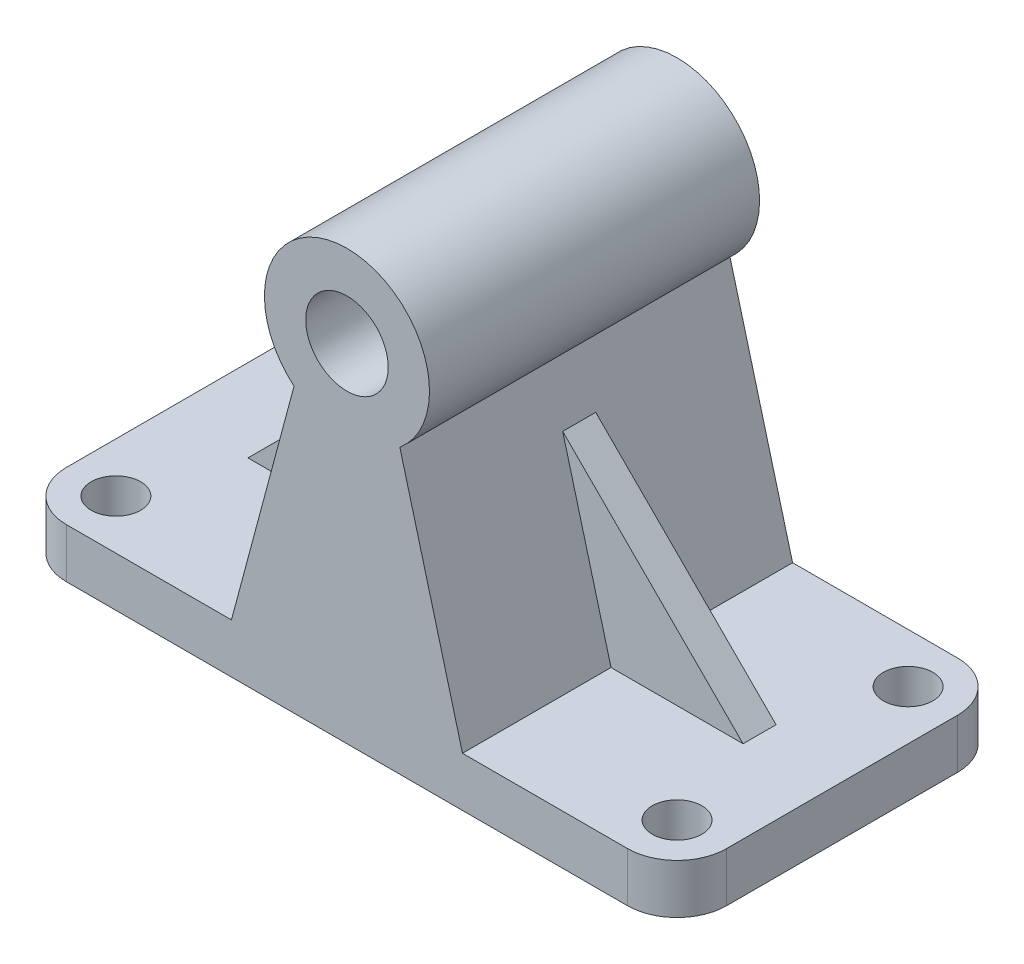
ISO-10303-21;
HEADER;
FILE_DESCRIPTION(('STEP AP214'),'2;1');
FILE_NAME('part.step','',(''),(''),'','','');
FILE_SCHEMA(('AUTOMOTIVE_DESIGN { 1 0 10303 214 1 1 1 1 }'));
ENDSEC;
DATA;
#1=APPLICATION_CONTEXT('core data for automotive mechanical design processes');
#2=APPLICATION_PROTOCOL_DEFINITION('international standard','automotive_design',2000,#1);
#3=PRODUCT_CONTEXT('',#1,'mechanical');
#4=PRODUCT('Part','Part','',(#3));
#5=PRODUCT_RELATED_PRODUCT_CATEGORY('part','',(#4));
#6=PRODUCT_DEFINITION_FORMATION('','',#4);
#7=PRODUCT_DEFINITION_CONTEXT('part definition',#1,'design');
#8=PRODUCT_DEFINITION('design','',#6,#7);
#9=PRODUCT_DEFINITION_SHAPE('','',#8);
#10=(LENGTH_UNIT() NAMED_UNIT(*) SI_UNIT(.MILLI.,.METRE.));
#11=(NAMED_UNIT(*) PLANE_ANGLE_UNIT() SI_UNIT($,.RADIAN.));
#12=(NAMED_UNIT(*) SI_UNIT($,.STERADIAN.) SOLID_ANGLE_UNIT());
#13=UNCERTAINTY_MEASURE_WITH_UNIT(LENGTH_MEASURE(1.E-05),#10,'distance_accuracy_value','');
#14=(GEOMETRIC_REPRESENTATION_CONTEXT(3) GLOBAL_UNCERTAINTY_ASSIGNED_CONTEXT((#13)) GLOBAL_UNIT_ASSIGNED_CONTEXT((#10,
#11,#12)) REPRESENTATION_CONTEXT('',''));
#15=CARTESIAN_POINT('',(0.,0.,0.));
#16=DIRECTION('',(0.,0.,1.));
#17=DIRECTION('',(1.,0.,0.));
#18=AXIS2_PLACEMENT_3D('',#15,#16,#17);
#19=CARTESIAN_POINT('',(0.,105.,50.));
#20=DIRECTION('',(0.,0.,1.));
#21=DIRECTION('',(1.,0.,0.));
#22=AXIS2_PLACEMENT_3D('',#19,#20,#21);
#23=PLANE('',#22);
#24=DIRECTION('',(-1.,0.,0.));
#25=VECTOR('',#24,1.);
#26=CARTESIAN_POINT('',(-100.,15.,50.));
#27=LINE('',#26,#25);
#28=CARTESIAN_POINT('',(-35.,15.,50.));
#29=VERTEX_POINT('',#28);
#30=CARTESIAN_POINT('',(-85.,15.,50.));
#31=VERTEX_POINT('',#30);
#32=EDGE_CURVE('E284',#29,#31,#27,.T.);
#33=ORIENTED_EDGE('',*,*,#32,.T.);
#34=DIRECTION('',(0.,-1.,0.));
#35=VECTOR('',#34,1.);
#36=CARTESIAN_POINT('',(-85.,0.,50.));
#37=LINE('',#36,#35);
#38=CARTESIAN_POINT('',(-85.,0.,50.));
#39=VERTEX_POINT('',#38);
#40=EDGE_CURVE('E341',#31,#39,#37,.T.);
#41=ORIENTED_EDGE('',*,*,#40,.T.);
#42=DIRECTION('',(1.,0.,0.));
#43=VECTOR('',#42,1.);
#44=CARTESIAN_POINT('',(-100.,0.,50.));
#45=LINE('',#44,#43);
#46=CARTESIAN_POINT('',(85.,0.,50.));
#47=VERTEX_POINT('',#46);
#48=EDGE_CURVE('E267',#39,#47,#45,.T.);
#49=ORIENTED_EDGE('',*,*,#48,.T.);
#50=DIRECTION('',(0.,1.,0.));
#51=VECTOR('',#50,1.);
#52=CARTESIAN_POINT('',(85.,15.,50.));
#53=LINE('',#52,#51);
#54=CARTESIAN_POINT('',(85.,15.,50.));
#55=VERTEX_POINT('',#54);
#56=EDGE_CURVE('E337',#47,#55,#53,.T.);
#57=ORIENTED_EDGE('',*,*,#56,.T.);
#58=DIRECTION('',(-1.,0.,0.));
#59=VECTOR('',#58,1.);
#60=CARTESIAN_POINT('',(35.,15.,50.));
#61=LINE('',#60,#59);
#62=CARTESIAN_POINT('',(35.,15.,50.));
#63=VERTEX_POINT('',#62);
#64=EDGE_CURVE('E271',#55,#63,#61,.T.);
#65=ORIENTED_EDGE('',*,*,#64,.T.);
#66=DIRECTION('',(-0.258819045102518,0.965925826289069,0.));
#67=VECTOR('',#66,1.);
#68=CARTESIAN_POINT('',(16.025916537381,85.8122435095476,50.));
#69=LINE('',#68,#67);
#70=CARTESIAN_POINT('',(16.025916537381,85.8122435095476,50.));
#71=VERTEX_POINT('',#70);
#72=EDGE_CURVE('E275',#63,#71,#69,.T.);
#73=ORIENTED_EDGE('',*,*,#72,.T.);
#74=CARTESIAN_POINT('',(0.,105.,50.));
#75=DIRECTION('',(0.,0.,1.));
#76=DIRECTION('',(1.,0.,0.));
#77=AXIS2_PLACEMENT_3D('',#74,#75,#76);
#78=CIRCLE('',#77,25.);
#79=CARTESIAN_POINT('',(-16.025916537381,85.8122435095476,50.));
#80=VERTEX_POINT('',#79);
#81=EDGE_CURVE('E278',#71,#80,#78,.T.);
#82=ORIENTED_EDGE('',*,*,#81,.T.);
#83=DIRECTION('',(-0.258819045102518,-0.965925826289069,0.));
#84=VECTOR('',#83,1.);
#85=CARTESIAN_POINT('',(-35.,15.,50.));
#86=LINE('',#85,#84);
#87=EDGE_CURVE('E281',#80,#29,#86,.T.);
#88=ORIENTED_EDGE('',*,*,#87,.T.);
#89=EDGE_LOOP('',(#33,#41,#49,#57,#65,#73,#82,#88));
#90=FACE_BOUND('',#89,.T.);
#91=CARTESIAN_POINT('',(0.,105.,50.));
#92=DIRECTION('',(0.,0.,1.));
#93=DIRECTION('',(1.,0.,0.));
#94=AXIS2_PLACEMENT_3D('',#91,#92,#93);
#95=CIRCLE('',#94,12.5);
#96=CARTESIAN_POINT('',(12.5,105.,50.));
#97=VERTEX_POINT('',#96);
#98=EDGE_CURVE('E259',#97,#97,#95,.T.);
#99=ORIENTED_EDGE('',*,*,#98,.F.);
#100=EDGE_LOOP('',(#99));
#101=FACE_BOUND('',#100,.T.);
#102=ADVANCED_FACE('F39',(#90,#101),#23,.T.);
#103=CARTESIAN_POINT('',(0.,105.,-50.));
#104=DIRECTION('',(0.,0.,1.));
#105=DIRECTION('',(1.,0.,0.));
#106=AXIS2_PLACEMENT_3D('',#103,#104,#105);
#107=PLANE('',#106);
#108=DIRECTION('',(1.,0.,0.));
#109=VECTOR('',#108,1.);
#110=CARTESIAN_POINT('',(-100.,0.,-50.));
#111=LINE('',#110,#109);
#112=CARTESIAN_POINT('',(-85.,0.,-50.));
#113=VERTEX_POINT('',#112);
#114=CARTESIAN_POINT('',(85.,0.,-50.));
#115=VERTEX_POINT('',#114);
#116=EDGE_CURVE('E263',#113,#115,#111,.T.);
#117=ORIENTED_EDGE('',*,*,#116,.F.);
#118=DIRECTION('',(0.,-1.,0.));
#119=VECTOR('',#118,1.);
#120=CARTESIAN_POINT('',(-85.,105.,-50.));
#121=LINE('',#120,#119);
#122=CARTESIAN_POINT('',(-85.,15.,-50.));
#123=VERTEX_POINT('',#122);
#124=EDGE_CURVE('E375',#113,#123,#121,.F.);
#125=ORIENTED_EDGE('',*,*,#124,.T.);
#126=DIRECTION('',(-1.,0.,0.));
#127=VECTOR('',#126,1.);
#128=CARTESIAN_POINT('',(-100.,15.,-50.));
#129=LINE('',#128,#127);
#130=CARTESIAN_POINT('',(-35.,15.,-50.));
#131=VERTEX_POINT('',#130);
#132=EDGE_CURVE('E272',#131,#123,#129,.T.);
#133=ORIENTED_EDGE('',*,*,#132,.F.);
#134=DIRECTION('',(-0.258819045102518,-0.965925826289069,0.));
#135=VECTOR('',#134,1.);
#136=CARTESIAN_POINT('',(-35.,15.,-50.));
#137=LINE('',#136,#135);
#138=CARTESIAN_POINT('',(-16.025916537381,85.8122435095476,-50.));
#139=VERTEX_POINT('',#138);
#140=EDGE_CURVE('E304',#139,#131,#137,.T.);
#141=ORIENTED_EDGE('',*,*,#140,.F.);
#142=CARTESIAN_POINT('',(0.,105.,-50.));
#143=DIRECTION('',(0.,0.,1.));
#144=DIRECTION('',(1.,0.,0.));
#145=AXIS2_PLACEMENT_3D('',#142,#143,#144);
#146=CIRCLE('',#145,25.);
#147=CARTESIAN_POINT('',(16.025916537381,85.8122435095476,-50.));
#148=VERTEX_POINT('',#147);
#149=EDGE_CURVE('E300',#148,#139,#146,.T.);
#150=ORIENTED_EDGE('',*,*,#149,.F.);
#151=DIRECTION('',(-0.258819045102518,0.965925826289069,0.));
#152=VECTOR('',#151,1.);
#153=CARTESIAN_POINT('',(16.025916537381,85.8122435095476,-50.));
#154=LINE('',#153,#152);
#155=CARTESIAN_POINT('',(35.,15.,-50.));
#156=VERTEX_POINT('',#155);
#157=EDGE_CURVE('E296',#156,#148,#154,.T.);
#158=ORIENTED_EDGE('',*,*,#157,.F.);
#159=DIRECTION('',(-1.,0.,0.));
#160=VECTOR('',#159,1.);
#161=CARTESIAN_POINT('',(35.,15.,-50.));
#162=LINE('',#161,#160);
#163=CARTESIAN_POINT('',(85.,15.,-50.));
#164=VERTEX_POINT('',#163);
#165=EDGE_CURVE('E292',#164,#156,#162,.T.);
#166=ORIENTED_EDGE('',*,*,#165,.F.);
#167=DIRECTION('',(0.,1.,0.));
#168=VECTOR('',#167,1.);
#169=CARTESIAN_POINT('',(85.,105.,-50.));
#170=LINE('',#169,#168);
#171=EDGE_CURVE('E372',#164,#115,#170,.F.);
#172=ORIENTED_EDGE('',*,*,#171,.T.);
#173=EDGE_LOOP('',(#117,#125,#133,#141,#150,#158,#166,#172));
#174=FACE_BOUND('',#173,.T.);
#175=CARTESIAN_POINT('',(0.,105.,-50.));
#176=DIRECTION('',(0.,0.,1.));
#177=DIRECTION('',(1.,0.,0.));
#178=AXIS2_PLACEMENT_3D('',#175,#176,#177);
#179=CIRCLE('',#178,12.5);
#180=CARTESIAN_POINT('',(12.5,105.,-50.));
#181=VERTEX_POINT('',#180);
#182=EDGE_CURVE('E255',#181,#181,#179,.T.);
#183=ORIENTED_EDGE('',*,*,#182,.T.);
#184=EDGE_LOOP('',(#183));
#185=FACE_BOUND('',#184,.T.);
#186=ADVANCED_FACE('F425',(#174,#185),#107,.F.);
#187=CARTESIAN_POINT('',(-100.,0.,50.));
#188=DIRECTION('',(1.,0.,0.));
#189=DIRECTION('',(0.,0.,-1.));
#190=AXIS2_PLACEMENT_3D('',#187,#188,#189);
#191=PLANE('',#190);
#192=DIRECTION('',(0.,0.,-1.));
#193=VECTOR('',#192,1.);
#194=CARTESIAN_POINT('',(-100.,15.,50.));
#195=LINE('',#194,#193);
#196=CARTESIAN_POINT('',(-100.,15.,35.));
#197=VERTEX_POINT('',#196);
#198=CARTESIAN_POINT('',(-100.,15.,-35.));
#199=VERTEX_POINT('',#198);
#200=EDGE_CURVE('E288',#197,#199,#195,.T.);
#201=ORIENTED_EDGE('',*,*,#200,.T.);
#202=DIRECTION('',(0.,-1.,0.));
#203=VECTOR('',#202,1.);
#204=CARTESIAN_POINT('',(-100.,0.,-35.));
#205=LINE('',#204,#203);
#206=CARTESIAN_POINT('',(-100.,0.,-35.));
#207=VERTEX_POINT('',#206);
#208=EDGE_CURVE('E358',#199,#207,#205,.T.);
#209=ORIENTED_EDGE('',*,*,#208,.T.);
#210=DIRECTION('',(0.,0.,-1.));
#211=VECTOR('',#210,1.);
#212=CARTESIAN_POINT('',(-100.,0.,50.));
#213=LINE('',#212,#211);
#214=CARTESIAN_POINT('',(-100.,0.,35.));
#215=VERTEX_POINT('',#214);
#216=EDGE_CURVE('E334',#215,#207,#213,.T.);
#217=ORIENTED_EDGE('',*,*,#216,.F.);
#218=DIRECTION('',(0.,-1.,0.));
#219=VECTOR('',#218,1.);
#220=CARTESIAN_POINT('',(-100.,15.,35.));
#221=LINE('',#220,#219);
#222=EDGE_CURVE('E362',#215,#197,#221,.F.);
#223=ORIENTED_EDGE('',*,*,#222,.T.);
#224=EDGE_LOOP('',(#201,#209,#217,#223));
#225=FACE_BOUND('',#224,.T.);
#226=ADVANCED_FACE('F415',(#225),#191,.F.);
#227=CARTESIAN_POINT('',(-100.,0.,50.));
#228=DIRECTION('',(0.,1.,0.));
#229=DIRECTION('',(0.,0.,1.));
#230=AXIS2_PLACEMENT_3D('',#227,#228,#229);
#231=PLANE('',#230);
#232=CARTESIAN_POINT('',(85.,0.,-35.));
#233=DIRECTION('',(0.,1.,0.));
#234=DIRECTION('',(0.,0.,1.));
#235=AXIS2_PLACEMENT_3D('',#232,#233,#234);
#236=CIRCLE('',#235,15.);
#237=CARTESIAN_POINT('',(100.,0.,-35.));
#238=VERTEX_POINT('',#237);
#239=EDGE_CURVE('E348',#115,#238,#236,.F.);
#240=ORIENTED_EDGE('',*,*,#239,.T.);
#241=DIRECTION('',(0.,0.,-1.));
#242=VECTOR('',#241,1.);
#243=CARTESIAN_POINT('',(100.,0.,50.));
#244=LINE('',#243,#242);
#245=CARTESIAN_POINT('',(100.,0.,35.));
#246=VERTEX_POINT('',#245);
#247=EDGE_CURVE('E331',#246,#238,#244,.T.);
#248=ORIENTED_EDGE('',*,*,#247,.F.);
#249=CARTESIAN_POINT('',(85.,0.,35.));
#250=DIRECTION('',(0.,1.,0.));
#251=DIRECTION('',(0.,0.,1.));
#252=AXIS2_PLACEMENT_3D('',#249,#250,#251);
#253=CIRCLE('',#252,15.);
#254=EDGE_CURVE('E345',#246,#47,#253,.F.);
#255=ORIENTED_EDGE('',*,*,#254,.T.);
#256=ORIENTED_EDGE('',*,*,#48,.F.);
#257=CARTESIAN_POINT('',(-85.,0.,35.));
#258=DIRECTION('',(0.,1.,0.));
#259=DIRECTION('',(0.,0.,1.));
#260=AXIS2_PLACEMENT_3D('',#257,#258,#259);
#261=CIRCLE('',#260,15.);
#262=EDGE_CURVE('E355',#39,#215,#261,.F.);
#263=ORIENTED_EDGE('',*,*,#262,.T.);
#264=ORIENTED_EDGE('',*,*,#216,.T.);
#265=CARTESIAN_POINT('',(-85.,0.,-35.));
#266=DIRECTION('',(0.,1.,0.));
#267=DIRECTION('',(0.,0.,1.));
#268=AXIS2_PLACEMENT_3D('',#265,#266,#267);
#269=CIRCLE('',#268,15.);
#270=EDGE_CURVE('E352',#207,#113,#269,.F.);
#271=ORIENTED_EDGE('',*,*,#270,.T.);
#272=ORIENTED_EDGE('',*,*,#116,.T.);
#273=EDGE_LOOP('',(#240,#248,#255,#256,#263,#264,#271,#272));
#274=FACE_BOUND('',#273,.T.);
#275=CARTESIAN_POINT('',(-85.,0.,35.));
#276=DIRECTION('',(0.,1.,0.));
#277=DIRECTION('',(-1.,0.,0.));
#278=AXIS2_PLACEMENT_3D('',#275,#276,#277);
#279=CIRCLE('',#278,7.50000000000001);
#280=CARTESIAN_POINT('',(-92.5,0.,35.));
#281=VERTEX_POINT('',#280);
#282=EDGE_CURVE('E235',#281,#281,#279,.T.);
#283=ORIENTED_EDGE('',*,*,#282,.T.);
#284=EDGE_LOOP('',(#283));
#285=FACE_BOUND('',#284,.T.);
#286=CARTESIAN_POINT('',(85.,0.,-35.));
#287=DIRECTION('',(0.,1.,0.));
#288=DIRECTION('',(-1.,0.,0.));
#289=AXIS2_PLACEMENT_3D('',#286,#287,#288);
#290=CIRCLE('',#289,7.50000000000001);
#291=CARTESIAN_POINT('',(77.5,0.,-35.));
#292=VERTEX_POINT('',#291);
#293=EDGE_CURVE('E244',#292,#292,#290,.T.);
#294=ORIENTED_EDGE('',*,*,#293,.T.);
#295=EDGE_LOOP('',(#294));
#296=FACE_BOUND('',#295,.T.);
#297=CARTESIAN_POINT('',(85.,0.,35.));
#298=DIRECTION('',(0.,1.,0.));
#299=DIRECTION('',(-1.,0.,0.));
#300=AXIS2_PLACEMENT_3D('',#297,#298,#299);
#301=CIRCLE('',#300,7.50000000000001);
#302=CARTESIAN_POINT('',(77.5,0.,35.));
#303=VERTEX_POINT('',#302);
#304=EDGE_CURVE('E227',#303,#303,#301,.T.);
#305=ORIENTED_EDGE('',*,*,#304,.T.);
#306=EDGE_LOOP('',(#305));
#307=FACE_BOUND('',#306,.T.);
#308=CARTESIAN_POINT('',(-85.,0.,-35.));
#309=DIRECTION('',(0.,1.,0.));
#310=DIRECTION('',(-1.,0.,0.));
#311=AXIS2_PLACEMENT_3D('',#308,#309,#310);
#312=CIRCLE('',#311,7.50000000000001);
#313=CARTESIAN_POINT('',(-92.5,0.,-35.));
#314=VERTEX_POINT('',#313);
#315=EDGE_CURVE('E251',#314,#314,#312,.T.);
#316=ORIENTED_EDGE('',*,*,#315,.T.);
#317=EDGE_LOOP('',(#316));
#318=FACE_BOUND('',#317,.T.);
#319=ADVANCED_FACE('F402',(#274,#285,#296,#307,#318),#231,.F.);
#320=CARTESIAN_POINT('',(100.,0.,50.));
#321=DIRECTION('',(-1.,0.,0.));
#322=DIRECTION('',(0.,0.,1.));
#323=AXIS2_PLACEMENT_3D('',#320,#321,#322);
#324=PLANE('',#323);
#325=ORIENTED_EDGE('',*,*,#247,.T.);
#326=DIRECTION('',(0.,1.,0.));
#327=VECTOR('',#326,1.);
#328=CARTESIAN_POINT('',(100.,0.,-35.));
#329=LINE('',#328,#327);
#330=CARTESIAN_POINT('',(100.,15.,-35.));
#331=VERTEX_POINT('',#330);
#332=EDGE_CURVE('E381',#238,#331,#329,.T.);
#333=ORIENTED_EDGE('',*,*,#332,.T.);
#334=DIRECTION('',(0.,0.,-1.));
#335=VECTOR('',#334,1.);
#336=CARTESIAN_POINT('',(100.,15.,50.));
#337=LINE('',#336,#335);
#338=CARTESIAN_POINT('',(100.,15.,35.));
#339=VERTEX_POINT('',#338);
#340=EDGE_CURVE('E328',#339,#331,#337,.T.);
#341=ORIENTED_EDGE('',*,*,#340,.F.);
#342=DIRECTION('',(0.,1.,0.));
#343=VECTOR('',#342,1.);
#344=CARTESIAN_POINT('',(100.,0.,35.));
#345=LINE('',#344,#343);
#346=EDGE_CURVE('E378',#339,#246,#345,.F.);
#347=ORIENTED_EDGE('',*,*,#346,.T.);
#348=EDGE_LOOP('',(#325,#333,#341,#347));
#349=FACE_BOUND('',#348,.T.);
#350=ADVANCED_FACE('F396',(#349),#324,.F.);
#351=CARTESIAN_POINT('',(35.,15.,50.));
#352=DIRECTION('',(0.,-1.,0.));
#353=DIRECTION('',(1.,0.,0.));
#354=AXIS2_PLACEMENT_3D('',#351,#352,#353);
#355=PLANE('',#354);
#356=CARTESIAN_POINT('',(85.,15.,35.));
#357=DIRECTION('',(0.,1.,0.));
#358=DIRECTION('',(-1.,0.,0.));
#359=AXIS2_PLACEMENT_3D('',#356,#357,#358);
#360=CIRCLE('',#359,7.50000000000001);
#361=CARTESIAN_POINT('',(77.5,15.,35.));
#362=VERTEX_POINT('',#361);
#363=EDGE_CURVE('E226',#362,#362,#360,.T.);
#364=ORIENTED_EDGE('',*,*,#363,.F.);
#365=EDGE_LOOP('',(#364));
#366=FACE_BOUND('',#365,.T.);
#367=ORIENTED_EDGE('',*,*,#340,.T.);
#368=CARTESIAN_POINT('',(85.,15.,-35.));
#369=DIRECTION('',(0.,-1.,0.));
#370=DIRECTION('',(1.,0.,0.));
#371=AXIS2_PLACEMENT_3D('',#368,#369,#370);
#372=CIRCLE('',#371,15.);
#373=EDGE_CURVE('E11',#331,#164,#372,.F.);
#374=ORIENTED_EDGE('',*,*,#373,.T.);
#375=ORIENTED_EDGE('',*,*,#165,.T.);
#376=DIRECTION('',(0.,0.,-1.));
#377=VECTOR('',#376,1.);
#378=CARTESIAN_POINT('',(35.,15.,50.));
#379=LINE('',#378,#377);
#380=CARTESIAN_POINT('',(35.,15.,-5.));
#381=VERTEX_POINT('',#380);
#382=EDGE_CURVE('E323',#381,#156,#379,.T.);
#383=ORIENTED_EDGE('',*,*,#382,.F.);
#384=DIRECTION('',(-1.,0.,0.));
#385=VECTOR('',#384,1.);
#386=CARTESIAN_POINT('',(35.,15.,-5.));
#387=LINE('',#386,#385);
#388=CARTESIAN_POINT('',(75.,15.,-5.));
#389=VERTEX_POINT('',#388);
#390=EDGE_CURVE('E210',#389,#381,#387,.T.);
#391=ORIENTED_EDGE('',*,*,#390,.F.);
#392=DIRECTION('',(0.,0.,1.));
#393=VECTOR('',#392,1.);
#394=CARTESIAN_POINT('',(75.,15.,50.));
#395=LINE('',#394,#393);
#396=CARTESIAN_POINT('',(75.,15.,5.));
#397=VERTEX_POINT('',#396);
#398=EDGE_CURVE('E223',#389,#397,#395,.T.);
#399=ORIENTED_EDGE('',*,*,#398,.T.);
#400=DIRECTION('',(-1.,0.,0.));
#401=VECTOR('',#400,1.);
#402=CARTESIAN_POINT('',(35.,15.,5.));
#403=LINE('',#402,#401);
#404=CARTESIAN_POINT('',(35.,15.,5.));
#405=VERTEX_POINT('',#404);
#406=EDGE_CURVE('E217',#397,#405,#403,.T.);
#407=ORIENTED_EDGE('',*,*,#406,.T.);
#408=EDGE_CURVE('E324',#63,#405,#379,.T.);
#409=ORIENTED_EDGE('',*,*,#408,.F.);
#410=ORIENTED_EDGE('',*,*,#64,.F.);
#411=CARTESIAN_POINT('',(85.,15.,35.));
#412=DIRECTION('',(0.,-1.,0.));
#413=DIRECTION('',(1.,0.,0.));
#414=AXIS2_PLACEMENT_3D('',#411,#412,#413);
#415=CIRCLE('',#414,15.);
#416=EDGE_CURVE('E48',#55,#339,#415,.F.);
#417=ORIENTED_EDGE('',*,*,#416,.T.);
#418=EDGE_LOOP('',(#367,#374,#375,#383,#391,#399,#407,#409,#410,#417));
#419=FACE_BOUND('',#418,.T.);
#420=CARTESIAN_POINT('',(85.,15.,-35.));
#421=DIRECTION('',(0.,1.,0.));
#422=DIRECTION('',(-1.,0.,0.));
#423=AXIS2_PLACEMENT_3D('',#420,#421,#422);
#424=CIRCLE('',#423,7.50000000000001);
#425=CARTESIAN_POINT('',(77.5,15.,-35.));
#426=VERTEX_POINT('',#425);
#427=EDGE_CURVE('E231',#426,#426,#424,.T.);
#428=ORIENTED_EDGE('',*,*,#427,.F.);
#429=EDGE_LOOP('',(#428));
#430=FACE_BOUND('',#429,.T.);
#431=ADVANCED_FACE('F388',(#366,#419,#430),#355,.F.);
#432=CARTESIAN_POINT('',(16.025916537381,85.8122435095476,50.));
#433=DIRECTION('',(-0.965925826289069,-0.258819045102518,0.));
#434=DIRECTION('',(0.258819045102518,-0.965925826289069,0.));
#435=AXIS2_PLACEMENT_3D('',#432,#433,#434);
#436=PLANE('',#435);
#437=DIRECTION('',(-0.258819045102518,0.965925826289069,0.));
#438=VECTOR('',#437,1.);
#439=CARTESIAN_POINT('',(16.025916537381,85.8122435095476,5.));
#440=LINE('',#439,#438);
#441=CARTESIAN_POINT('',(20.3589838486226,69.6410161513776,5.));
#442=VERTEX_POINT('',#441);
#443=EDGE_CURVE('E214',#405,#442,#440,.T.);
#444=ORIENTED_EDGE('',*,*,#443,.T.);
#445=DIRECTION('',(0.,0.,-1.));
#446=VECTOR('',#445,1.);
#447=CARTESIAN_POINT('',(20.3589838486226,69.6410161513776,50.));
#448=LINE('',#447,#446);
#449=CARTESIAN_POINT('',(20.3589838486227,69.6410161513775,-5.));
#450=VERTEX_POINT('',#449);
#451=EDGE_CURVE('E220',#442,#450,#448,.T.);
#452=ORIENTED_EDGE('',*,*,#451,.T.);
#453=DIRECTION('',(-0.258819045102518,0.965925826289069,0.));
#454=VECTOR('',#453,1.);
#455=CARTESIAN_POINT('',(16.025916537381,85.8122435095476,-5.));
#456=LINE('',#455,#454);
#457=EDGE_CURVE('E203',#381,#450,#456,.T.);
#458=ORIENTED_EDGE('',*,*,#457,.F.);
#459=ORIENTED_EDGE('',*,*,#382,.T.);
#460=ORIENTED_EDGE('',*,*,#157,.T.);
#461=DIRECTION('',(0.,0.,-1.));
#462=VECTOR('',#461,1.);
#463=CARTESIAN_POINT('',(16.025916537381,85.8122435095476,50.));
#464=LINE('',#463,#462);
#465=EDGE_CURVE('E320',#71,#148,#464,.T.);
#466=ORIENTED_EDGE('',*,*,#465,.F.);
#467=ORIENTED_EDGE('',*,*,#72,.F.);
#468=ORIENTED_EDGE('',*,*,#408,.T.);
#469=EDGE_LOOP('',(#444,#452,#458,#459,#460,#466,#467,#468));
#470=FACE_BOUND('',#469,.T.);
#471=ADVANCED_FACE('F438',(#470),#436,.F.);
#472=CARTESIAN_POINT('',(0.,105.,50.));
#473=DIRECTION('',(0.,0.,-1.));
#474=DIRECTION('',(-1.,0.,0.));
#475=AXIS2_PLACEMENT_3D('',#472,#473,#474);
#476=CYLINDRICAL_SURFACE('',#475,25.);
#477=ORIENTED_EDGE('',*,*,#465,.T.);
#478=ORIENTED_EDGE('',*,*,#149,.T.);
#479=DIRECTION('',(0.,0.,-1.));
#480=VECTOR('',#479,1.);
#481=CARTESIAN_POINT('',(-16.025916537381,85.8122435095476,50.));
#482=LINE('',#481,#480);
#483=EDGE_CURVE('E317',#80,#139,#482,.T.);
#484=ORIENTED_EDGE('',*,*,#483,.F.);
#485=ORIENTED_EDGE('',*,*,#81,.F.);
#486=EDGE_LOOP('',(#477,#478,#484,#485));
#487=FACE_BOUND('',#486,.T.);
#488=ADVANCED_FACE('F448',(#487),#476,.T.);
#489=CARTESIAN_POINT('',(-35.,15.,50.));
#490=DIRECTION('',(0.965925826289069,-0.258819045102518,0.));
#491=DIRECTION('',(0.258819045102518,0.965925826289069,0.));
#492=AXIS2_PLACEMENT_3D('',#489,#490,#491);
#493=PLANE('',#492);
#494=DIRECTION('',(0.,0.,-1.));
#495=VECTOR('',#494,1.);
#496=CARTESIAN_POINT('',(-20.3589838486226,69.6410161513776,50.));
#497=LINE('',#496,#495);
#498=CARTESIAN_POINT('',(-20.3589838486226,69.6410161513776,-5.));
#499=VERTEX_POINT('',#498);
#500=CARTESIAN_POINT('',(-20.3589838486226,69.6410161513776,5.));
#501=VERTEX_POINT('',#500);
#502=EDGE_CURVE('E55',#499,#501,#497,.F.);
#503=ORIENTED_EDGE('',*,*,#502,.T.);
#504=DIRECTION('',(-0.258819045102518,-0.965925826289069,0.));
#505=VECTOR('',#504,1.);
#506=CARTESIAN_POINT('',(-35.,15.,5.));
#507=LINE('',#506,#505);
#508=CARTESIAN_POINT('',(-35.,15.,5.));
#509=VERTEX_POINT('',#508);
#510=EDGE_CURVE('E175',#501,#509,#507,.T.);
#511=ORIENTED_EDGE('',*,*,#510,.T.);
#512=DIRECTION('',(0.,0.,-1.));
#513=VECTOR('',#512,1.);
#514=CARTESIAN_POINT('',(-35.,15.,50.));
#515=LINE('',#514,#513);
#516=EDGE_CURVE('E314',#29,#509,#515,.T.);
#517=ORIENTED_EDGE('',*,*,#516,.F.);
#518=ORIENTED_EDGE('',*,*,#87,.F.);
#519=ORIENTED_EDGE('',*,*,#483,.T.);
#520=ORIENTED_EDGE('',*,*,#140,.T.);
#521=CARTESIAN_POINT('',(-35.,15.,-5.));
#522=VERTEX_POINT('',#521);
#523=EDGE_CURVE('E313',#522,#131,#515,.T.);
#524=ORIENTED_EDGE('',*,*,#523,.F.);
#525=DIRECTION('',(-0.258819045102518,-0.965925826289069,0.));
#526=VECTOR('',#525,1.);
#527=CARTESIAN_POINT('',(-35.,15.,-5.));
#528=LINE('',#527,#526);
#529=EDGE_CURVE('E60',#499,#522,#528,.T.);
#530=ORIENTED_EDGE('',*,*,#529,.F.);
#531=EDGE_LOOP('',(#503,#511,#517,#518,#519,#520,#524,#530));
#532=FACE_BOUND('',#531,.T.);
#533=ADVANCED_FACE('F443',(#532),#493,.F.);
#534=CARTESIAN_POINT('',(-100.,15.,50.));
#535=DIRECTION('',(0.,-1.,0.));
#536=DIRECTION('',(1.,0.,0.));
#537=AXIS2_PLACEMENT_3D('',#534,#535,#536);
#538=PLANE('',#537);
#539=CARTESIAN_POINT('',(-85.,15.,35.));
#540=DIRECTION('',(0.,1.,0.));
#541=DIRECTION('',(-1.,0.,0.));
#542=AXIS2_PLACEMENT_3D('',#539,#540,#541);
#543=CIRCLE('',#542,7.50000000000001);
#544=CARTESIAN_POINT('',(-92.5,15.,35.));
#545=VERTEX_POINT('',#544);
#546=EDGE_CURVE('E240',#545,#545,#543,.T.);
#547=ORIENTED_EDGE('',*,*,#546,.F.);
#548=EDGE_LOOP('',(#547));
#549=FACE_BOUND('',#548,.T.);
#550=ORIENTED_EDGE('',*,*,#516,.T.);
#551=DIRECTION('',(-1.,0.,0.));
#552=VECTOR('',#551,1.);
#553=CARTESIAN_POINT('',(-100.,15.,5.));
#554=LINE('',#553,#552);
#555=CARTESIAN_POINT('',(-75.,15.,5.));
#556=VERTEX_POINT('',#555);
#557=EDGE_CURVE('E169',#509,#556,#554,.T.);
#558=ORIENTED_EDGE('',*,*,#557,.T.);
#559=DIRECTION('',(0.,0.,1.));
#560=VECTOR('',#559,1.);
#561=CARTESIAN_POINT('',(-75.,15.,50.));
#562=LINE('',#561,#560);
#563=CARTESIAN_POINT('',(-75.,15.,-5.));
#564=VERTEX_POINT('',#563);
#565=EDGE_CURVE('E162',#556,#564,#562,.F.);
#566=ORIENTED_EDGE('',*,*,#565,.T.);
#567=DIRECTION('',(-1.,0.,0.));
#568=VECTOR('',#567,1.);
#569=CARTESIAN_POINT('',(-100.,15.,-5.));
#570=LINE('',#569,#568);
#571=EDGE_CURVE('E167',#522,#564,#570,.T.);
#572=ORIENTED_EDGE('',*,*,#571,.F.);
#573=ORIENTED_EDGE('',*,*,#523,.T.);
#574=ORIENTED_EDGE('',*,*,#132,.T.);
#575=CARTESIAN_POINT('',(-85.,15.,-35.));
#576=DIRECTION('',(0.,-1.,0.));
#577=DIRECTION('',(1.,0.,0.));
#578=AXIS2_PLACEMENT_3D('',#575,#576,#577);
#579=CIRCLE('',#578,15.);
#580=EDGE_CURVE('E365',#123,#199,#579,.F.);
#581=ORIENTED_EDGE('',*,*,#580,.T.);
#582=ORIENTED_EDGE('',*,*,#200,.F.);
#583=CARTESIAN_POINT('',(-85.,15.,35.));
#584=DIRECTION('',(0.,-1.,0.));
#585=DIRECTION('',(1.,0.,0.));
#586=AXIS2_PLACEMENT_3D('',#583,#584,#585);
#587=CIRCLE('',#586,15.);
#588=EDGE_CURVE('E369',#197,#31,#587,.F.);
#589=ORIENTED_EDGE('',*,*,#588,.T.);
#590=ORIENTED_EDGE('',*,*,#32,.F.);
#591=EDGE_LOOP('',(#550,#558,#566,#572,#573,#574,#581,#582,#589,#590));
#592=FACE_BOUND('',#591,.T.);
#593=CARTESIAN_POINT('',(-85.,15.,-35.));
#594=DIRECTION('',(0.,1.,0.));
#595=DIRECTION('',(-1.,0.,0.));
#596=AXIS2_PLACEMENT_3D('',#593,#594,#595);
#597=CIRCLE('',#596,7.50000000000001);
#598=CARTESIAN_POINT('',(-92.5,15.,-35.));
#599=VERTEX_POINT('',#598);
#600=EDGE_CURVE('E239',#599,#599,#597,.T.);
#601=ORIENTED_EDGE('',*,*,#600,.F.);
#602=EDGE_LOOP('',(#601));
#603=FACE_BOUND('',#602,.T.);
#604=ADVANCED_FACE('F165',(#549,#592,#603),#538,.F.);
#605=CARTESIAN_POINT('',(0.,105.,50.));
#606=DIRECTION('',(0.,0.,-1.));
#607=DIRECTION('',(-1.,0.,0.));
#608=AXIS2_PLACEMENT_3D('',#605,#606,#607);
#609=CYLINDRICAL_SURFACE('',#608,12.5);
#610=ORIENTED_EDGE('',*,*,#98,.T.);
#611=EDGE_LOOP('',(#610));
#612=FACE_BOUND('',#611,.T.);
#613=ORIENTED_EDGE('',*,*,#182,.F.);
#614=EDGE_LOOP('',(#613));
#615=FACE_BOUND('',#614,.T.);
#616=ADVANCED_FACE('F478',(#612,#615),#609,.F.);
#617=CARTESIAN_POINT('',(-85.,105.,35.));
#618=DIRECTION('',(0.,1.,0.));
#619=DIRECTION('',(0.,0.,1.));
#620=AXIS2_PLACEMENT_3D('',#617,#618,#619);
#621=CYLINDRICAL_SURFACE('',#620,15.);
#622=ORIENTED_EDGE('',*,*,#588,.F.);
#623=ORIENTED_EDGE('',*,*,#222,.F.);
#624=ORIENTED_EDGE('',*,*,#262,.F.);
#625=ORIENTED_EDGE('',*,*,#40,.F.);
#626=EDGE_LOOP('',(#622,#623,#624,#625));
#627=FACE_BOUND('',#626,.T.);
#628=ADVANCED_FACE('F410',(#627),#621,.T.);
#629=CARTESIAN_POINT('',(-85.,0.,-35.));
#630=DIRECTION('',(0.,-1.,0.));
#631=DIRECTION('',(0.,0.,-1.));
#632=AXIS2_PLACEMENT_3D('',#629,#630,#631);
#633=CYLINDRICAL_SURFACE('',#632,15.);
#634=ORIENTED_EDGE('',*,*,#580,.F.);
#635=ORIENTED_EDGE('',*,*,#124,.F.);
#636=ORIENTED_EDGE('',*,*,#270,.F.);
#637=ORIENTED_EDGE('',*,*,#208,.F.);
#638=EDGE_LOOP('',(#634,#635,#636,#637));
#639=FACE_BOUND('',#638,.T.);
#640=ADVANCED_FACE('F420',(#639),#633,.T.);
#641=CARTESIAN_POINT('',(85.,0.,-35.));
#642=DIRECTION('',(0.,1.,0.));
#643=DIRECTION('',(0.,0.,1.));
#644=AXIS2_PLACEMENT_3D('',#641,#642,#643);
#645=CYLINDRICAL_SURFACE('',#644,15.);
#646=ORIENTED_EDGE('',*,*,#239,.F.);
#647=ORIENTED_EDGE('',*,*,#171,.F.);
#648=ORIENTED_EDGE('',*,*,#373,.F.);
#649=ORIENTED_EDGE('',*,*,#332,.F.);
#650=EDGE_LOOP('',(#646,#647,#648,#649));
#651=FACE_BOUND('',#650,.T.);
#652=ADVANCED_FACE('F432',(#651),#645,.T.);
#653=CARTESIAN_POINT('',(85.,105.,35.));
#654=DIRECTION('',(0.,-1.,0.));
#655=DIRECTION('',(0.,0.,-1.));
#656=AXIS2_PLACEMENT_3D('',#653,#654,#655);
#657=CYLINDRICAL_SURFACE('',#656,15.);
#658=ORIENTED_EDGE('',*,*,#254,.F.);
#659=ORIENTED_EDGE('',*,*,#346,.F.);
#660=ORIENTED_EDGE('',*,*,#416,.F.);
#661=ORIENTED_EDGE('',*,*,#56,.F.);
#662=EDGE_LOOP('',(#658,#659,#660,#661));
#663=FACE_BOUND('',#662,.T.);
#664=ADVANCED_FACE('F41',(#663),#657,.T.);
#665=CARTESIAN_POINT('',(-85.,0.,-35.));
#666=DIRECTION('',(0.,1.,0.));
#667=DIRECTION('',(-1.,0.,0.));
#668=AXIS2_PLACEMENT_3D('',#665,#666,#667);
#669=CYLINDRICAL_SURFACE('',#668,7.50000000000001);
#670=ORIENTED_EDGE('',*,*,#315,.F.);
#671=EDGE_LOOP('',(#670));
#672=FACE_BOUND('',#671,.T.);
#673=ORIENTED_EDGE('',*,*,#600,.T.);
#674=EDGE_LOOP('',(#673));
#675=FACE_BOUND('',#674,.T.);
#676=ADVANCED_FACE('F506',(#672,#675),#669,.F.);
#677=CARTESIAN_POINT('',(-85.,0.,35.));
#678=DIRECTION('',(0.,1.,0.));
#679=DIRECTION('',(-1.,0.,0.));
#680=AXIS2_PLACEMENT_3D('',#677,#678,#679);
#681=CYLINDRICAL_SURFACE('',#680,7.50000000000001);
#682=ORIENTED_EDGE('',*,*,#282,.F.);
#683=EDGE_LOOP('',(#682));
#684=FACE_BOUND('',#683,.T.);
#685=ORIENTED_EDGE('',*,*,#546,.T.);
#686=EDGE_LOOP('',(#685));
#687=FACE_BOUND('',#686,.T.);
#688=ADVANCED_FACE('F510',(#684,#687),#681,.F.);
#689=CARTESIAN_POINT('',(85.,0.,35.));
#690=DIRECTION('',(0.,1.,0.));
#691=DIRECTION('',(-1.,0.,0.));
#692=AXIS2_PLACEMENT_3D('',#689,#690,#691);
#693=CYLINDRICAL_SURFACE('',#692,7.50000000000001);
#694=ORIENTED_EDGE('',*,*,#304,.F.);
#695=EDGE_LOOP('',(#694));
#696=FACE_BOUND('',#695,.T.);
#697=ORIENTED_EDGE('',*,*,#363,.T.);
#698=EDGE_LOOP('',(#697));
#699=FACE_BOUND('',#698,.T.);
#700=ADVANCED_FACE('F515',(#696,#699),#693,.F.);
#701=CARTESIAN_POINT('',(85.,0.,-35.));
#702=DIRECTION('',(0.,1.,0.));
#703=DIRECTION('',(-1.,0.,0.));
#704=AXIS2_PLACEMENT_3D('',#701,#702,#703);
#705=CYLINDRICAL_SURFACE('',#704,7.50000000000001);
#706=ORIENTED_EDGE('',*,*,#293,.F.);
#707=EDGE_LOOP('',(#706));
#708=FACE_BOUND('',#707,.T.);
#709=ORIENTED_EDGE('',*,*,#427,.T.);
#710=EDGE_LOOP('',(#709));
#711=FACE_BOUND('',#710,.T.);
#712=ADVANCED_FACE('F521',(#708,#711),#705,.F.);
#713=CARTESIAN_POINT('',(75.,15.,0.));
#714=DIRECTION('',(0.707106781186549,0.707106781186546,0.));
#715=DIRECTION('',(-0.707106781186546,0.707106781186549,0.));
#716=AXIS2_PLACEMENT_3D('',#713,#714,#715);
#717=PLANE('',#716);
#718=ORIENTED_EDGE('',*,*,#398,.F.);
#719=DIRECTION('',(-0.707106781186546,0.707106781186549,0.));
#720=VECTOR('',#719,1.);
#721=CARTESIAN_POINT('',(75.,15.,-5.));
#722=LINE('',#721,#720);
#723=EDGE_CURVE('E198',#389,#450,#722,.T.);
#724=ORIENTED_EDGE('',*,*,#723,.T.);
#725=ORIENTED_EDGE('',*,*,#451,.F.);
#726=DIRECTION('',(-0.707106781186546,0.707106781186549,0.));
#727=VECTOR('',#726,1.);
#728=CARTESIAN_POINT('',(75.,15.,5.));
#729=LINE('',#728,#727);
#730=EDGE_CURVE('E199',#397,#442,#729,.T.);
#731=ORIENTED_EDGE('',*,*,#730,.F.);
#732=EDGE_LOOP('',(#718,#724,#725,#731));
#733=FACE_BOUND('',#732,.T.);
#734=ADVANCED_FACE('F457',(#733),#717,.T.);
#735=CARTESIAN_POINT('',(0.,65.,5.));
#736=DIRECTION('',(0.,0.,1.));
#737=DIRECTION('',(1.,0.,0.));
#738=AXIS2_PLACEMENT_3D('',#735,#736,#737);
#739=PLANE('',#738);
#740=ORIENTED_EDGE('',*,*,#406,.F.);
#741=ORIENTED_EDGE('',*,*,#730,.T.);
#742=ORIENTED_EDGE('',*,*,#443,.F.);
#743=EDGE_LOOP('',(#740,#741,#742));
#744=FACE_BOUND('',#743,.T.);
#745=ADVANCED_FACE('F453',(#744),#739,.T.);
#746=CARTESIAN_POINT('',(0.,65.,-5.));
#747=DIRECTION('',(0.,0.,1.));
#748=DIRECTION('',(1.,0.,0.));
#749=AXIS2_PLACEMENT_3D('',#746,#747,#748);
#750=PLANE('',#749);
#751=ORIENTED_EDGE('',*,*,#723,.F.);
#752=ORIENTED_EDGE('',*,*,#390,.T.);
#753=ORIENTED_EDGE('',*,*,#457,.T.);
#754=EDGE_LOOP('',(#751,#752,#753));
#755=FACE_BOUND('',#754,.T.);
#756=ADVANCED_FACE('F460',(#755),#750,.F.);
#757=CARTESIAN_POINT('',(-75.,15.,0.));
#758=DIRECTION('',(0.707106781186549,-0.707106781186546,0.));
#759=DIRECTION('',(0.707106781186546,0.707106781186549,0.));
#760=AXIS2_PLACEMENT_3D('',#757,#758,#759);
#761=PLANE('',#760);
#762=ORIENTED_EDGE('',*,*,#502,.F.);
#763=DIRECTION('',(0.707106781186546,0.707106781186549,0.));
#764=VECTOR('',#763,1.);
#765=CARTESIAN_POINT('',(-75.,15.,-5.));
#766=LINE('',#765,#764);
#767=EDGE_CURVE('E180',#564,#499,#766,.T.);
#768=ORIENTED_EDGE('',*,*,#767,.F.);
#769=ORIENTED_EDGE('',*,*,#565,.F.);
#770=DIRECTION('',(0.707106781186546,0.707106781186549,0.));
#771=VECTOR('',#770,1.);
#772=CARTESIAN_POINT('',(-75.,15.,5.));
#773=LINE('',#772,#771);
#774=EDGE_CURVE('E182',#556,#501,#773,.T.);
#775=ORIENTED_EDGE('',*,*,#774,.T.);
#776=EDGE_LOOP('',(#762,#768,#769,#775));
#777=FACE_BOUND('',#776,.T.);
#778=ADVANCED_FACE('F184',(#777),#761,.F.);
#779=CARTESIAN_POINT('',(0.,65.,5.));
#780=DIRECTION('',(0.,0.,1.));
#781=DIRECTION('',(1.,0.,0.));
#782=AXIS2_PLACEMENT_3D('',#779,#780,#781);
#783=PLANE('',#782);
#784=ORIENTED_EDGE('',*,*,#510,.F.);
#785=ORIENTED_EDGE('',*,*,#774,.F.);
#786=ORIENTED_EDGE('',*,*,#557,.F.);
#787=EDGE_LOOP('',(#784,#785,#786));
#788=FACE_BOUND('',#787,.T.);
#789=ADVANCED_FACE('F467',(#788),#783,.T.);
#790=CARTESIAN_POINT('',(0.,65.,-5.));
#791=DIRECTION('',(0.,0.,1.));
#792=DIRECTION('',(1.,0.,0.));
#793=AXIS2_PLACEMENT_3D('',#790,#791,#792);
#794=PLANE('',#793);
#795=ORIENTED_EDGE('',*,*,#767,.T.);
#796=ORIENTED_EDGE('',*,*,#529,.T.);
#797=ORIENTED_EDGE('',*,*,#571,.T.);
#798=EDGE_LOOP('',(#795,#796,#797));
#799=FACE_BOUND('',#798,.T.);
#800=ADVANCED_FACE('F179',(#799),#794,.F.);
#801=CLOSED_SHELL('',(#102,#186,#226,#319,#350,#431,#471,#488,#533,#604,#616,#628,#640,#652,
#664,#676,#688,#700,#712,#734,#745,#756,#778,#789,#800));
#802=MANIFOLD_SOLID_BREP('B2',#801);
#803=ADVANCED_BREP_SHAPE_REPRESENTATION('',(#18,#802),#14);
#804=SHAPE_DEFINITION_REPRESENTATION(#9,#803);
ENDSEC;
END-ISO-10303-21;
